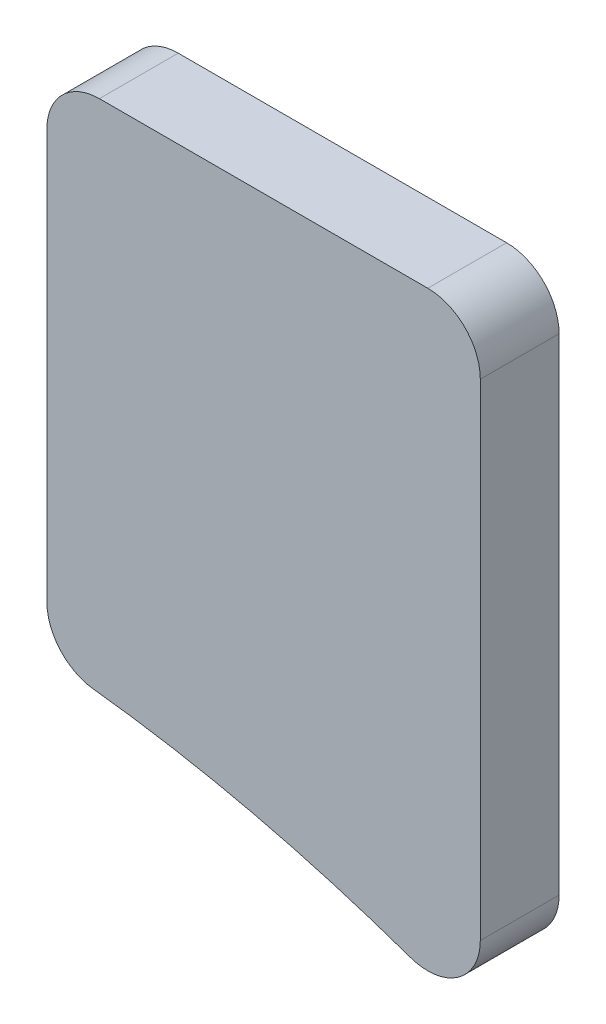
ISO-10303-21;
HEADER;
FILE_DESCRIPTION(('STEP AP214'),'2;1');
FILE_NAME('part.step','',(''),(''),'','','');
FILE_SCHEMA(('AUTOMOTIVE_DESIGN { 1 0 10303 214 1 1 1 1 }'));
ENDSEC;
DATA;
#1=APPLICATION_CONTEXT('core data for automotive mechanical design processes');
#2=APPLICATION_PROTOCOL_DEFINITION('international standard','automotive_design',2000,#1);
#3=PRODUCT_CONTEXT('',#1,'mechanical');
#4=PRODUCT('Part','Part','',(#3));
#5=PRODUCT_RELATED_PRODUCT_CATEGORY('part','',(#4));
#6=PRODUCT_DEFINITION_FORMATION('','',#4);
#7=PRODUCT_DEFINITION_CONTEXT('part definition',#1,'design');
#8=PRODUCT_DEFINITION('design','',#6,#7);
#9=PRODUCT_DEFINITION_SHAPE('','',#8);
#10=(LENGTH_UNIT() NAMED_UNIT(*) SI_UNIT(.MILLI.,.METRE.));
#11=(NAMED_UNIT(*) PLANE_ANGLE_UNIT() SI_UNIT($,.RADIAN.));
#12=(NAMED_UNIT(*) SI_UNIT($,.STERADIAN.) SOLID_ANGLE_UNIT());
#13=UNCERTAINTY_MEASURE_WITH_UNIT(LENGTH_MEASURE(1.E-05),#10,'distance_accuracy_value','');
#14=(GEOMETRIC_REPRESENTATION_CONTEXT(3) GLOBAL_UNCERTAINTY_ASSIGNED_CONTEXT((#13)) GLOBAL_UNIT_ASSIGNED_CONTEXT((#10,
#11,#12)) REPRESENTATION_CONTEXT('',''));
#15=CARTESIAN_POINT('',(0.,0.,0.));
#16=DIRECTION('',(0.,0.,1.));
#17=DIRECTION('',(1.,0.,0.));
#18=AXIS2_PLACEMENT_3D('',#15,#16,#17);
#19=CARTESIAN_POINT('',(4.,10.4575606682553,-3.));
#20=DIRECTION('',(0.,1.,0.));
#21=DIRECTION('',(0.,0.,1.));
#22=AXIS2_PLACEMENT_3D('',#19,#20,#21);
#23=PLANE('',#22);
#24=DIRECTION('',(-1.,0.,0.));
#25=VECTOR('',#24,1.);
#26=CARTESIAN_POINT('',(4.,10.4575606682553,0.));
#27=LINE('',#26,#25);
#28=CARTESIAN_POINT('',(18.5,10.4575606682553,0.));
#29=VERTEX_POINT('',#28);
#30=CARTESIAN_POINT('',(6.,10.4575606682553,0.));
#31=VERTEX_POINT('',#30);
#32=EDGE_CURVE('E152',#29,#31,#27,.T.);
#33=ORIENTED_EDGE('',*,*,#32,.F.);
#34=DIRECTION('',(0.,0.,1.));
#35=VECTOR('',#34,1.);
#36=CARTESIAN_POINT('',(18.5,10.4575606682553,-3.));
#37=LINE('',#36,#35);
#38=CARTESIAN_POINT('',(18.5,10.4575606682553,-3.));
#39=VERTEX_POINT('',#38);
#40=EDGE_CURVE('E11',#29,#39,#37,.F.);
#41=ORIENTED_EDGE('',*,*,#40,.T.);
#42=DIRECTION('',(-1.,0.,0.));
#43=VECTOR('',#42,1.);
#44=CARTESIAN_POINT('',(4.,10.4575606682553,-3.));
#45=LINE('',#44,#43);
#46=CARTESIAN_POINT('',(6.,10.4575606682553,-3.));
#47=VERTEX_POINT('',#46);
#48=EDGE_CURVE('E155',#39,#47,#45,.T.);
#49=ORIENTED_EDGE('',*,*,#48,.T.);
#50=DIRECTION('',(0.,0.,1.));
#51=VECTOR('',#50,1.);
#52=CARTESIAN_POINT('',(6.,10.4575606682553,-3.));
#53=LINE('',#52,#51);
#54=EDGE_CURVE('E40',#47,#31,#53,.T.);
#55=ORIENTED_EDGE('',*,*,#54,.T.);
#56=EDGE_LOOP('',(#33,#41,#49,#55));
#57=FACE_BOUND('',#56,.T.);
#58=ADVANCED_FACE('F32',(#57),#23,.T.);
#59=CARTESIAN_POINT('',(20.5,10.4575606682553,-3.));
#60=DIRECTION('',(1.,0.,0.));
#61=DIRECTION('',(0.,1.,0.));
#62=AXIS2_PLACEMENT_3D('',#59,#60,#61);
#63=PLANE('',#62);
#64=DIRECTION('',(0.,1.,0.));
#65=VECTOR('',#64,1.);
#66=CARTESIAN_POINT('',(20.5,10.4575606682553,0.));
#67=LINE('',#66,#65);
#68=CARTESIAN_POINT('',(20.5,-10.0498102959361,0.));
#69=VERTEX_POINT('',#68);
#70=CARTESIAN_POINT('',(20.5,8.45756066825529,0.));
#71=VERTEX_POINT('',#70);
#72=EDGE_CURVE('E117',#69,#71,#67,.T.);
#73=ORIENTED_EDGE('',*,*,#72,.F.);
#74=DIRECTION('',(0.,0.,1.));
#75=VECTOR('',#74,1.);
#76=CARTESIAN_POINT('',(20.5,-10.0498102959361,-3.));
#77=LINE('',#76,#75);
#78=CARTESIAN_POINT('',(20.5,-10.0498102959361,-3.));
#79=VERTEX_POINT('',#78);
#80=EDGE_CURVE('E135',#69,#79,#77,.F.);
#81=ORIENTED_EDGE('',*,*,#80,.T.);
#82=DIRECTION('',(0.,1.,0.));
#83=VECTOR('',#82,1.);
#84=CARTESIAN_POINT('',(20.5,10.4575606682553,-3.));
#85=LINE('',#84,#83);
#86=CARTESIAN_POINT('',(20.5,8.45756066825529,-3.));
#87=VERTEX_POINT('',#86);
#88=EDGE_CURVE('E120',#79,#87,#85,.T.);
#89=ORIENTED_EDGE('',*,*,#88,.T.);
#90=DIRECTION('',(0.,0.,1.));
#91=VECTOR('',#90,1.);
#92=CARTESIAN_POINT('',(20.5,8.45756066825529,-3.));
#93=LINE('',#92,#91);
#94=EDGE_CURVE('E132',#87,#71,#93,.T.);
#95=ORIENTED_EDGE('',*,*,#94,.T.);
#96=EDGE_LOOP('',(#73,#81,#89,#95));
#97=FACE_BOUND('',#96,.T.);
#98=ADVANCED_FACE('F181',(#97),#63,.T.);
#99=CARTESIAN_POINT('',(4.,-8.95243933174471,-3.));
#100=CARTESIAN_POINT('',(9.49999999998145,-9.38700723299084,-3.));
#101=CARTESIAN_POINT('',(14.9999999999761,-10.7178714305192,-3.));
#102=CARTESIAN_POINT('',(20.5,-12.9450319243363,-3.));
#103=B_SPLINE_CURVE_WITH_KNOTS('',3,(#99,#100,#101,#102),.UNSPECIFIED.,.F.,.F.,(4,4),
(0.588888888891741,0.955555555556357),.UNSPECIFIED.);
#104=DIRECTION('',(0.,0.,1.));
#105=VECTOR('',#104,1.);
#106=SURFACE_OF_LINEAR_EXTRUSION('',#103,#105);
#107=CARTESIAN_POINT('',(5.77338454835417,-9.1236192739034,-3.));
#108=VERTEX_POINT('',#107);
#109=CARTESIAN_POINT('',(17.835427434964,-11.9361674481746,-3.));
#110=VERTEX_POINT('',#109);
#111=EDGE_CURVE('E125',#108,#110,#103,.T.);
#112=ORIENTED_EDGE('',*,*,#111,.T.);
#113=DIRECTION('',(0.,0.,1.));
#114=VECTOR('',#113,1.);
#115=CARTESIAN_POINT('',(17.8354274349636,-11.9361674481745,-3.));
#116=LINE('',#115,#114);
#117=CARTESIAN_POINT('',(17.8354274349636,-11.9361674481745,0.));
#118=VERTEX_POINT('',#117);
#119=EDGE_CURVE('E116',#110,#118,#116,.T.);
#120=ORIENTED_EDGE('',*,*,#119,.T.);
#121=CARTESIAN_POINT('',(4.,-8.95243933174471,0.));
#122=CARTESIAN_POINT('',(9.49999999998145,-9.38700723299084,0.));
#123=CARTESIAN_POINT('',(14.9999999999761,-10.7178714305192,0.));
#124=CARTESIAN_POINT('',(20.5,-12.9450319243363,0.));
#125=B_SPLINE_CURVE_WITH_KNOTS('',3,(#121,#122,#123,#124),.UNSPECIFIED.,.F.,.F.,(4,4),
(0.588888888891741,0.955555555556357),.UNSPECIFIED.);
#126=CARTESIAN_POINT('',(5.77338454835417,-9.1236192739034,0.));
#127=VERTEX_POINT('',#126);
#128=EDGE_CURVE('E101',#127,#118,#125,.T.);
#129=ORIENTED_EDGE('',*,*,#128,.F.);
#130=DIRECTION('',(0.,0.,1.));
#131=VECTOR('',#130,1.);
#132=CARTESIAN_POINT('',(5.77338454835417,-9.1236192739034,0.));
#133=LINE('',#132,#131);
#134=EDGE_CURVE('E114',#127,#108,#133,.F.);
#135=ORIENTED_EDGE('',*,*,#134,.T.);
#136=EDGE_LOOP('',(#112,#120,#129,#135));
#137=FACE_BOUND('',#136,.T.);
#138=ADVANCED_FACE('F113',(#137),#106,.T.);
#139=CARTESIAN_POINT('',(4.,10.4575606682553,-3.));
#140=DIRECTION('',(-1.,0.,0.));
#141=DIRECTION('',(0.,-1.,0.));
#142=AXIS2_PLACEMENT_3D('',#139,#140,#141);
#143=PLANE('',#142);
#144=DIRECTION('',(0.,-1.,0.));
#145=VECTOR('',#144,1.);
#146=CARTESIAN_POINT('',(4.,10.4575606682553,-3.));
#147=LINE('',#146,#145);
#148=CARTESIAN_POINT('',(4.,8.45756066825529,-3.));
#149=VERTEX_POINT('',#148);
#150=CARTESIAN_POINT('',(4.,-7.13649938897563,-3.));
#151=VERTEX_POINT('',#150);
#152=EDGE_CURVE('E171',#149,#151,#147,.T.);
#153=ORIENTED_EDGE('',*,*,#152,.T.);
#154=DIRECTION('',(0.,0.,1.));
#155=VECTOR('',#154,1.);
#156=CARTESIAN_POINT('',(4.,-7.13649938897563,-3.));
#157=LINE('',#156,#155);
#158=CARTESIAN_POINT('',(4.,-7.13649938897563,0.));
#159=VERTEX_POINT('',#158);
#160=EDGE_CURVE('E145',#151,#159,#157,.T.);
#161=ORIENTED_EDGE('',*,*,#160,.T.);
#162=DIRECTION('',(0.,-1.,0.));
#163=VECTOR('',#162,1.);
#164=CARTESIAN_POINT('',(4.,10.4575606682553,0.));
#165=LINE('',#164,#163);
#166=CARTESIAN_POINT('',(4.,8.45756066825529,0.));
#167=VERTEX_POINT('',#166);
#168=EDGE_CURVE('E102',#167,#159,#165,.T.);
#169=ORIENTED_EDGE('',*,*,#168,.F.);
#170=DIRECTION('',(0.,0.,1.));
#171=VECTOR('',#170,1.);
#172=CARTESIAN_POINT('',(4.,8.45756066825529,-3.));
#173=LINE('',#172,#171);
#174=EDGE_CURVE('E54',#167,#149,#173,.F.);
#175=ORIENTED_EDGE('',*,*,#174,.T.);
#176=EDGE_LOOP('',(#153,#161,#169,#175));
#177=FACE_BOUND('',#176,.T.);
#178=ADVANCED_FACE('F180',(#177),#143,.T.);
#179=CARTESIAN_POINT('',(12.2499999999841,-10.2765134058264,-3.));
#180=DIRECTION('',(0.,0.,1.));
#181=DIRECTION('',(1.,0.,0.));
#182=AXIS2_PLACEMENT_3D('',#179,#180,#181);
#183=PLANE('',#182);
#184=ORIENTED_EDGE('',*,*,#88,.F.);
#185=CARTESIAN_POINT('',(18.5,-10.0498102959361,-3.));
#186=DIRECTION('',(0.,0.,1.));
#187=DIRECTION('',(1.,0.,0.));
#188=AXIS2_PLACEMENT_3D('',#185,#186,#187);
#189=CIRCLE('',#188,2.);
#190=EDGE_CURVE('E142',#79,#110,#189,.F.);
#191=ORIENTED_EDGE('',*,*,#190,.T.);
#192=ORIENTED_EDGE('',*,*,#111,.F.);
#193=CARTESIAN_POINT('',(5.99999999999999,-7.13649938897563,-3.));
#194=DIRECTION('',(0.,0.,1.));
#195=DIRECTION('',(1.,0.,0.));
#196=AXIS2_PLACEMENT_3D('',#193,#194,#195);
#197=CIRCLE('',#196,2.);
#198=EDGE_CURVE('E47',#108,#151,#197,.F.);
#199=ORIENTED_EDGE('',*,*,#198,.T.);
#200=ORIENTED_EDGE('',*,*,#152,.F.);
#201=CARTESIAN_POINT('',(6.,8.45756066825529,-3.));
#202=DIRECTION('',(0.,0.,1.));
#203=DIRECTION('',(1.,0.,0.));
#204=AXIS2_PLACEMENT_3D('',#201,#202,#203);
#205=CIRCLE('',#204,2.);
#206=EDGE_CURVE('E137',#149,#47,#205,.F.);
#207=ORIENTED_EDGE('',*,*,#206,.T.);
#208=ORIENTED_EDGE('',*,*,#48,.F.);
#209=CARTESIAN_POINT('',(18.5,8.45756066825529,-3.));
#210=DIRECTION('',(0.,0.,1.));
#211=DIRECTION('',(1.,0.,0.));
#212=AXIS2_PLACEMENT_3D('',#209,#210,#211);
#213=CIRCLE('',#212,2.);
#214=EDGE_CURVE('E139',#39,#87,#213,.F.);
#215=ORIENTED_EDGE('',*,*,#214,.T.);
#216=EDGE_LOOP('',(#184,#191,#192,#199,#200,#207,#208,#215));
#217=FACE_BOUND('',#216,.T.);
#218=ADVANCED_FACE('F185',(#217),#183,.F.);
#219=CARTESIAN_POINT('',(12.2499999999841,-10.2765134058264,0.));
#220=DIRECTION('',(0.,0.,1.));
#221=DIRECTION('',(1.,0.,0.));
#222=AXIS2_PLACEMENT_3D('',#219,#220,#221);
#223=PLANE('',#222);
#224=ORIENTED_EDGE('',*,*,#128,.T.);
#225=CARTESIAN_POINT('',(18.5,-10.0498102959361,0.));
#226=DIRECTION('',(0.,0.,1.));
#227=DIRECTION('',(1.,0.,0.));
#228=AXIS2_PLACEMENT_3D('',#225,#226,#227);
#229=CIRCLE('',#228,2.);
#230=EDGE_CURVE('E107',#118,#69,#229,.T.);
#231=ORIENTED_EDGE('',*,*,#230,.T.);
#232=ORIENTED_EDGE('',*,*,#72,.T.);
#233=CARTESIAN_POINT('',(18.5,8.45756066825529,0.));
#234=DIRECTION('',(0.,0.,1.));
#235=DIRECTION('',(1.,0.,0.));
#236=AXIS2_PLACEMENT_3D('',#233,#234,#235);
#237=CIRCLE('',#236,2.);
#238=EDGE_CURVE('E108',#71,#29,#237,.T.);
#239=ORIENTED_EDGE('',*,*,#238,.T.);
#240=ORIENTED_EDGE('',*,*,#32,.T.);
#241=CARTESIAN_POINT('',(6.,8.45756066825529,0.));
#242=DIRECTION('',(0.,0.,1.));
#243=DIRECTION('',(1.,0.,0.));
#244=AXIS2_PLACEMENT_3D('',#241,#242,#243);
#245=CIRCLE('',#244,2.);
#246=EDGE_CURVE('E122',#31,#167,#245,.T.);
#247=ORIENTED_EDGE('',*,*,#246,.T.);
#248=ORIENTED_EDGE('',*,*,#168,.T.);
#249=CARTESIAN_POINT('',(5.99999999999999,-7.13649938897563,0.));
#250=DIRECTION('',(0.,0.,1.));
#251=DIRECTION('',(1.,0.,0.));
#252=AXIS2_PLACEMENT_3D('',#249,#250,#251);
#253=CIRCLE('',#252,2.);
#254=EDGE_CURVE('E98',#159,#127,#253,.T.);
#255=ORIENTED_EDGE('',*,*,#254,.T.);
#256=EDGE_LOOP('',(#224,#231,#232,#239,#240,#247,#248,#255));
#257=FACE_BOUND('',#256,.T.);
#258=ADVANCED_FACE('F100',(#257),#223,.T.);
#259=CARTESIAN_POINT('',(18.5,-10.0498102959361,-1.5));
#260=DIRECTION('',(0.,0.,1.));
#261=DIRECTION('',(1.,0.,0.));
#262=AXIS2_PLACEMENT_3D('',#259,#260,#261);
#263=CYLINDRICAL_SURFACE('',#262,2.);
#264=ORIENTED_EDGE('',*,*,#190,.F.);
#265=ORIENTED_EDGE('',*,*,#80,.F.);
#266=ORIENTED_EDGE('',*,*,#230,.F.);
#267=ORIENTED_EDGE('',*,*,#119,.F.);
#268=EDGE_LOOP('',(#264,#265,#266,#267));
#269=FACE_BOUND('',#268,.T.);
#270=ADVANCED_FACE('F188',(#269),#263,.T.);
#271=CARTESIAN_POINT('',(5.99999999999999,-7.13649938897563,-1.5));
#272=DIRECTION('',(0.,0.,1.));
#273=DIRECTION('',(1.,0.,0.));
#274=AXIS2_PLACEMENT_3D('',#271,#272,#273);
#275=CYLINDRICAL_SURFACE('',#274,2.);
#276=ORIENTED_EDGE('',*,*,#198,.F.);
#277=ORIENTED_EDGE('',*,*,#134,.F.);
#278=ORIENTED_EDGE('',*,*,#254,.F.);
#279=ORIENTED_EDGE('',*,*,#160,.F.);
#280=EDGE_LOOP('',(#276,#277,#278,#279));
#281=FACE_BOUND('',#280,.T.);
#282=ADVANCED_FACE('F119',(#281),#275,.T.);
#283=CARTESIAN_POINT('',(18.5,8.45756066825529,-3.));
#284=DIRECTION('',(0.,0.,1.));
#285=DIRECTION('',(1.,0.,0.));
#286=AXIS2_PLACEMENT_3D('',#283,#284,#285);
#287=CYLINDRICAL_SURFACE('',#286,2.);
#288=ORIENTED_EDGE('',*,*,#214,.F.);
#289=ORIENTED_EDGE('',*,*,#40,.F.);
#290=ORIENTED_EDGE('',*,*,#238,.F.);
#291=ORIENTED_EDGE('',*,*,#94,.F.);
#292=EDGE_LOOP('',(#288,#289,#290,#291));
#293=FACE_BOUND('',#292,.T.);
#294=ADVANCED_FACE('F193',(#293),#287,.T.);
#295=CARTESIAN_POINT('',(6.,8.45756066825529,-3.));
#296=DIRECTION('',(0.,0.,1.));
#297=DIRECTION('',(1.,0.,0.));
#298=AXIS2_PLACEMENT_3D('',#295,#296,#297);
#299=CYLINDRICAL_SURFACE('',#298,2.);
#300=ORIENTED_EDGE('',*,*,#206,.F.);
#301=ORIENTED_EDGE('',*,*,#174,.F.);
#302=ORIENTED_EDGE('',*,*,#246,.F.);
#303=ORIENTED_EDGE('',*,*,#54,.F.);
#304=EDGE_LOOP('',(#300,#301,#302,#303));
#305=FACE_BOUND('',#304,.T.);
#306=ADVANCED_FACE('F34',(#305),#299,.T.);
#307=CLOSED_SHELL('',(#58,#98,#138,#178,#218,#258,#270,#282,#294,#306));
#308=MANIFOLD_SOLID_BREP('B2',#307);
#309=ADVANCED_BREP_SHAPE_REPRESENTATION('',(#18,#308),#14);
#310=SHAPE_DEFINITION_REPRESENTATION(#9,#309);
ENDSEC;
END-ISO-10303-21;
